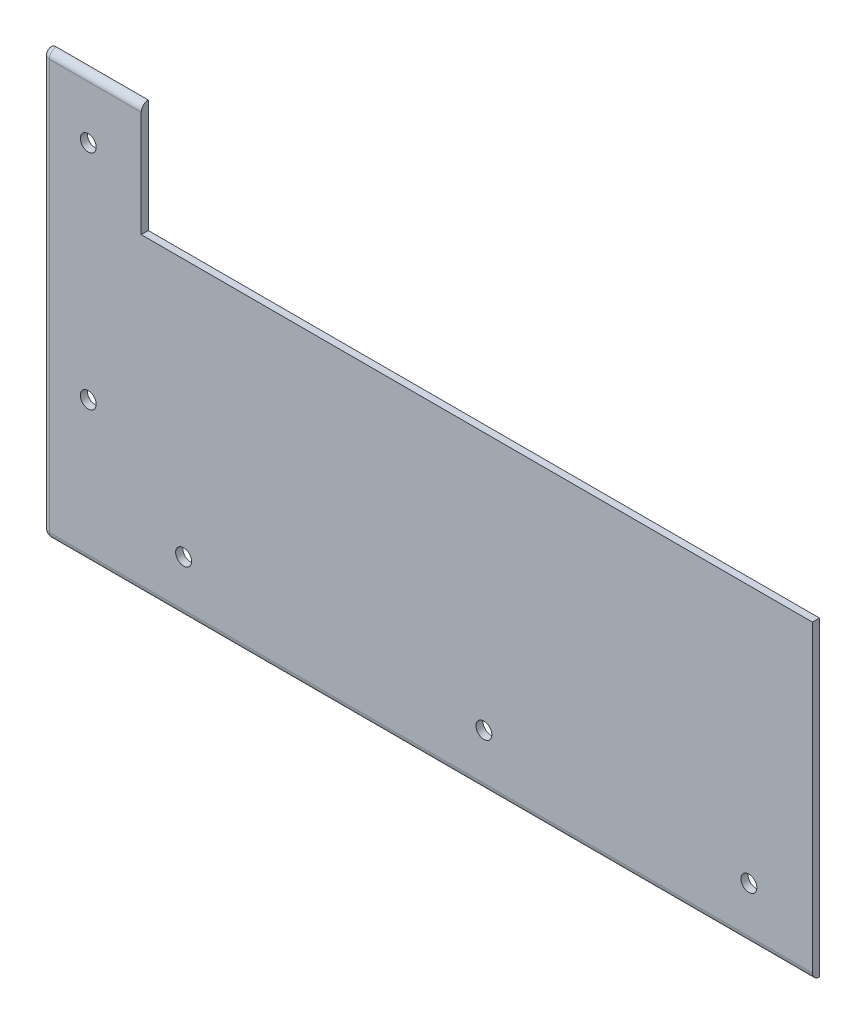
ISO-10303-21;
HEADER;
FILE_DESCRIPTION(('STEP AP214'),'2;1');
FILE_NAME('part.step','',(''),(''),'','','');
FILE_SCHEMA(('AUTOMOTIVE_DESIGN { 1 0 10303 214 1 1 1 1 }'));
ENDSEC;
DATA;
#1=APPLICATION_CONTEXT('core data for automotive mechanical design processes');
#2=APPLICATION_PROTOCOL_DEFINITION('international standard','automotive_design',2000,#1);
#3=PRODUCT_CONTEXT('',#1,'mechanical');
#4=PRODUCT('Part','Part','',(#3));
#5=PRODUCT_RELATED_PRODUCT_CATEGORY('part','',(#4));
#6=PRODUCT_DEFINITION_FORMATION('','',#4);
#7=PRODUCT_DEFINITION_CONTEXT('part definition',#1,'design');
#8=PRODUCT_DEFINITION('design','',#6,#7);
#9=PRODUCT_DEFINITION_SHAPE('','',#8);
#10=(LENGTH_UNIT() NAMED_UNIT(*) SI_UNIT(.MILLI.,.METRE.));
#11=(NAMED_UNIT(*) PLANE_ANGLE_UNIT() SI_UNIT($,.RADIAN.));
#12=(NAMED_UNIT(*) SI_UNIT($,.STERADIAN.) SOLID_ANGLE_UNIT());
#13=UNCERTAINTY_MEASURE_WITH_UNIT(LENGTH_MEASURE(1.E-05),#10,'distance_accuracy_value','');
#14=(GEOMETRIC_REPRESENTATION_CONTEXT(3) GLOBAL_UNCERTAINTY_ASSIGNED_CONTEXT((#13)) GLOBAL_UNIT_ASSIGNED_CONTEXT((#10,
#11,#12)) REPRESENTATION_CONTEXT('',''));
#15=CARTESIAN_POINT('',(0.,0.,0.));
#16=DIRECTION('',(0.,0.,1.));
#17=DIRECTION('',(1.,0.,0.));
#18=AXIS2_PLACEMENT_3D('',#15,#16,#17);
#19=CARTESIAN_POINT('',(109.,60.,0.));
#20=DIRECTION('',(0.,0.,1.));
#21=DIRECTION('',(1.,0.,0.));
#22=AXIS2_PLACEMENT_3D('',#19,#20,#21);
#23=PLANE('',#22);
#24=CARTESIAN_POINT('',(13.,40.,0.));
#25=DIRECTION('',(0.,0.,-1.));
#26=DIRECTION('',(1.,0.,0.));
#27=AXIS2_PLACEMENT_3D('',#24,#25,#26);
#28=CIRCLE('',#27,2.25);
#29=CARTESIAN_POINT('',(10.75,40.,0.));
#30=VERTEX_POINT('',#29);
#31=EDGE_CURVE('E247',#30,#30,#28,.T.);
#32=ORIENTED_EDGE('',*,*,#31,.F.);
#33=EDGE_LOOP('',(#32));
#34=FACE_BOUND('',#33,.T.);
#35=CARTESIAN_POINT('',(40.,15.,0.));
#36=DIRECTION('',(0.,0.,-1.));
#37=DIRECTION('',(1.,0.,0.));
#38=AXIS2_PLACEMENT_3D('',#35,#36,#37);
#39=CIRCLE('',#38,2.25);
#40=CARTESIAN_POINT('',(37.75,15.,0.));
#41=VERTEX_POINT('',#40);
#42=EDGE_CURVE('E195',#41,#41,#39,.T.);
#43=ORIENTED_EDGE('',*,*,#42,.F.);
#44=EDGE_LOOP('',(#43));
#45=FACE_BOUND('',#44,.T.);
#46=CARTESIAN_POINT('',(125.,15.,0.));
#47=DIRECTION('',(0.,0.,-1.));
#48=DIRECTION('',(1.,0.,0.));
#49=AXIS2_PLACEMENT_3D('',#46,#47,#48);
#50=CIRCLE('',#49,2.25);
#51=CARTESIAN_POINT('',(122.75,15.,0.));
#52=VERTEX_POINT('',#51);
#53=EDGE_CURVE('E187',#52,#52,#50,.T.);
#54=ORIENTED_EDGE('',*,*,#53,.F.);
#55=EDGE_LOOP('',(#54));
#56=FACE_BOUND('',#55,.T.);
#57=CARTESIAN_POINT('',(13.,103.,0.));
#58=DIRECTION('',(0.,0.,-1.));
#59=DIRECTION('',(1.,0.,0.));
#60=AXIS2_PLACEMENT_3D('',#57,#58,#59);
#61=CIRCLE('',#60,2.25);
#62=CARTESIAN_POINT('',(10.75,103.,0.));
#63=VERTEX_POINT('',#62);
#64=EDGE_CURVE('E223',#63,#63,#61,.T.);
#65=ORIENTED_EDGE('',*,*,#64,.F.);
#66=EDGE_LOOP('',(#65));
#67=FACE_BOUND('',#66,.T.);
#68=CARTESIAN_POINT('',(200.,15.,0.));
#69=DIRECTION('',(0.,0.,-1.));
#70=DIRECTION('',(1.,0.,0.));
#71=AXIS2_PLACEMENT_3D('',#68,#69,#70);
#72=CIRCLE('',#71,2.25);
#73=CARTESIAN_POINT('',(197.75,15.,0.));
#74=VERTEX_POINT('',#73);
#75=EDGE_CURVE('E26',#74,#74,#72,.T.);
#76=ORIENTED_EDGE('',*,*,#75,.F.);
#77=EDGE_LOOP('',(#76));
#78=FACE_BOUND('',#77,.T.);
#79=CARTESIAN_POINT('',(2.,118.,0.));
#80=DIRECTION('',(0.,0.,1.));
#81=DIRECTION('',(0.,1.,0.));
#82=AXIS2_PLACEMENT_3D('',#79,#80,#81);
#83=CIRCLE('',#82,2.);
#84=CARTESIAN_POINT('',(2.,120.,0.));
#85=VERTEX_POINT('',#84);
#86=CARTESIAN_POINT('',(0.,118.,0.));
#87=VERTEX_POINT('',#86);
#88=EDGE_CURVE('E151',#85,#87,#83,.T.);
#89=ORIENTED_EDGE('',*,*,#88,.F.);
#90=DIRECTION('',(1.,0.,0.));
#91=VECTOR('',#90,1.);
#92=CARTESIAN_POINT('',(2.,120.,0.));
#93=LINE('',#92,#91);
#94=CARTESIAN_POINT('',(28.,120.,0.));
#95=VERTEX_POINT('',#94);
#96=EDGE_CURVE('E170',#85,#95,#93,.T.);
#97=ORIENTED_EDGE('',*,*,#96,.T.);
#98=DIRECTION('',(0.,-1.,0.));
#99=VECTOR('',#98,1.);
#100=CARTESIAN_POINT('',(28.,120.,0.));
#101=LINE('',#100,#99);
#102=CARTESIAN_POINT('',(28.,88.,0.));
#103=VERTEX_POINT('',#102);
#104=EDGE_CURVE('E160',#95,#103,#101,.T.);
#105=ORIENTED_EDGE('',*,*,#104,.T.);
#106=DIRECTION('',(1.,0.,0.));
#107=VECTOR('',#106,1.);
#108=CARTESIAN_POINT('',(28.,88.,0.));
#109=LINE('',#108,#107);
#110=CARTESIAN_POINT('',(218.,88.,0.));
#111=VERTEX_POINT('',#110);
#112=EDGE_CURVE('E10',#103,#111,#109,.T.);
#113=ORIENTED_EDGE('',*,*,#112,.T.);
#114=DIRECTION('',(0.,-1.,0.));
#115=VECTOR('',#114,1.);
#116=CARTESIAN_POINT('',(218.,88.,0.));
#117=LINE('',#116,#115);
#118=CARTESIAN_POINT('',(218.,0.,0.));
#119=VERTEX_POINT('',#118);
#120=EDGE_CURVE('E134',#111,#119,#117,.T.);
#121=ORIENTED_EDGE('',*,*,#120,.T.);
#122=DIRECTION('',(1.,0.,0.));
#123=VECTOR('',#122,1.);
#124=CARTESIAN_POINT('',(2.,0.,0.));
#125=LINE('',#124,#123);
#126=CARTESIAN_POINT('',(2.,0.,0.));
#127=VERTEX_POINT('',#126);
#128=EDGE_CURVE('E227',#127,#119,#125,.T.);
#129=ORIENTED_EDGE('',*,*,#128,.F.);
#130=CARTESIAN_POINT('',(2.,2.,0.));
#131=DIRECTION('',(0.,0.,1.));
#132=DIRECTION('',(-1.,0.,0.));
#133=AXIS2_PLACEMENT_3D('',#130,#131,#132);
#134=CIRCLE('',#133,2.);
#135=CARTESIAN_POINT('',(0.,2.,0.));
#136=VERTEX_POINT('',#135);
#137=EDGE_CURVE('E230',#136,#127,#134,.T.);
#138=ORIENTED_EDGE('',*,*,#137,.F.);
#139=DIRECTION('',(0.,1.,0.));
#140=VECTOR('',#139,1.);
#141=CARTESIAN_POINT('',(0.,2.,0.));
#142=LINE('',#141,#140);
#143=EDGE_CURVE('E206',#136,#87,#142,.T.);
#144=ORIENTED_EDGE('',*,*,#143,.T.);
#145=EDGE_LOOP('',(#89,#97,#105,#113,#121,#129,#138,#144));
#146=FACE_BOUND('',#145,.T.);
#147=ADVANCED_FACE('F15',(#34,#45,#56,#67,#78,#146),#23,.F.);
#148=CARTESIAN_POINT('',(218.,88.,0.));
#149=DIRECTION('',(0.,1.,0.));
#150=DIRECTION('',(1.,0.,0.));
#151=AXIS2_PLACEMENT_3D('',#148,#149,#150);
#152=PLANE('',#151);
#153=ORIENTED_EDGE('',*,*,#112,.F.);
#154=DIRECTION('',(0.,0.,1.));
#155=VECTOR('',#154,1.);
#156=CARTESIAN_POINT('',(28.,88.,0.));
#157=LINE('',#156,#155);
#158=CARTESIAN_POINT('',(28.,88.,2.));
#159=VERTEX_POINT('',#158);
#160=EDGE_CURVE('E166',#103,#159,#157,.T.);
#161=ORIENTED_EDGE('',*,*,#160,.T.);
#162=DIRECTION('',(-1.,0.,0.));
#163=VECTOR('',#162,1.);
#164=CARTESIAN_POINT('',(28.,88.,2.));
#165=LINE('',#164,#163);
#166=CARTESIAN_POINT('',(218.,88.,2.));
#167=VERTEX_POINT('',#166);
#168=EDGE_CURVE('E194',#167,#159,#165,.T.);
#169=ORIENTED_EDGE('',*,*,#168,.F.);
#170=DIRECTION('',(0.,0.,1.));
#171=VECTOR('',#170,1.);
#172=CARTESIAN_POINT('',(218.,88.,0.));
#173=LINE('',#172,#171);
#174=EDGE_CURVE('E248',#111,#167,#173,.T.);
#175=ORIENTED_EDGE('',*,*,#174,.F.);
#176=EDGE_LOOP('',(#153,#161,#169,#175));
#177=FACE_BOUND('',#176,.T.);
#178=ADVANCED_FACE('F366',(#177),#152,.T.);
#179=CARTESIAN_POINT('',(200.,15.,0.));
#180=DIRECTION('',(0.,0.,1.));
#181=DIRECTION('',(1.,0.,0.));
#182=AXIS2_PLACEMENT_3D('',#179,#180,#181);
#183=CYLINDRICAL_SURFACE('',#182,2.25);
#184=CARTESIAN_POINT('',(200.,15.,2.));
#185=DIRECTION('',(0.,0.,-1.));
#186=DIRECTION('',(1.,0.,0.));
#187=AXIS2_PLACEMENT_3D('',#184,#185,#186);
#188=CIRCLE('',#187,2.25);
#189=CARTESIAN_POINT('',(197.75,15.,2.));
#190=VERTEX_POINT('',#189);
#191=EDGE_CURVE('E266',#190,#190,#188,.T.);
#192=ORIENTED_EDGE('',*,*,#191,.F.);
#193=DIRECTION('',(0.,0.,-1.));
#194=VECTOR('',#193,1.);
#195=CARTESIAN_POINT('',(197.75,15.,0.));
#196=LINE('',#195,#194);
#197=EDGE_CURVE('E19',#190,#74,#196,.T.);
#198=ORIENTED_EDGE('',*,*,#197,.T.);
#199=ORIENTED_EDGE('',*,*,#75,.T.);
#200=ORIENTED_EDGE('',*,*,#197,.F.);
#201=EDGE_LOOP('',(#192,#198,#199,#200));
#202=FACE_BOUND('',#201,.T.);
#203=ADVANCED_FACE('F17',(#202),#183,.F.);
#204=CARTESIAN_POINT('',(13.,103.,0.));
#205=DIRECTION('',(0.,0.,1.));
#206=DIRECTION('',(1.,0.,0.));
#207=AXIS2_PLACEMENT_3D('',#204,#205,#206);
#208=CYLINDRICAL_SURFACE('',#207,2.25);
#209=CARTESIAN_POINT('',(13.,103.,2.));
#210=DIRECTION('',(0.,0.,-1.));
#211=DIRECTION('',(1.,0.,0.));
#212=AXIS2_PLACEMENT_3D('',#209,#210,#211);
#213=CIRCLE('',#212,2.25);
#214=CARTESIAN_POINT('',(10.75,103.,2.));
#215=VERTEX_POINT('',#214);
#216=EDGE_CURVE('E201',#215,#215,#213,.T.);
#217=ORIENTED_EDGE('',*,*,#216,.F.);
#218=DIRECTION('',(0.,0.,-1.));
#219=VECTOR('',#218,1.);
#220=CARTESIAN_POINT('',(10.75,103.,0.));
#221=LINE('',#220,#219);
#222=EDGE_CURVE('E219',#215,#63,#221,.T.);
#223=ORIENTED_EDGE('',*,*,#222,.T.);
#224=ORIENTED_EDGE('',*,*,#64,.T.);
#225=ORIENTED_EDGE('',*,*,#222,.F.);
#226=EDGE_LOOP('',(#217,#223,#224,#225));
#227=FACE_BOUND('',#226,.T.);
#228=ADVANCED_FACE('F388',(#227),#208,.F.);
#229=CARTESIAN_POINT('',(125.,15.,0.));
#230=DIRECTION('',(0.,0.,1.));
#231=DIRECTION('',(1.,0.,0.));
#232=AXIS2_PLACEMENT_3D('',#229,#230,#231);
#233=CYLINDRICAL_SURFACE('',#232,2.25);
#234=CARTESIAN_POINT('',(125.,15.,2.));
#235=DIRECTION('',(0.,0.,-1.));
#236=DIRECTION('',(1.,0.,0.));
#237=AXIS2_PLACEMENT_3D('',#234,#235,#236);
#238=CIRCLE('',#237,2.25);
#239=CARTESIAN_POINT('',(122.75,15.,2.));
#240=VERTEX_POINT('',#239);
#241=EDGE_CURVE('E198',#240,#240,#238,.T.);
#242=ORIENTED_EDGE('',*,*,#241,.F.);
#243=DIRECTION('',(0.,0.,-1.));
#244=VECTOR('',#243,1.);
#245=CARTESIAN_POINT('',(122.75,15.,0.));
#246=LINE('',#245,#244);
#247=EDGE_CURVE('E106',#240,#52,#246,.T.);
#248=ORIENTED_EDGE('',*,*,#247,.T.);
#249=ORIENTED_EDGE('',*,*,#53,.T.);
#250=ORIENTED_EDGE('',*,*,#247,.F.);
#251=EDGE_LOOP('',(#242,#248,#249,#250));
#252=FACE_BOUND('',#251,.T.);
#253=ADVANCED_FACE('F393',(#252),#233,.F.);
#254=CARTESIAN_POINT('',(40.,15.,0.));
#255=DIRECTION('',(0.,0.,1.));
#256=DIRECTION('',(1.,0.,0.));
#257=AXIS2_PLACEMENT_3D('',#254,#255,#256);
#258=CYLINDRICAL_SURFACE('',#257,2.25);
#259=CARTESIAN_POINT('',(40.,15.,2.));
#260=DIRECTION('',(0.,0.,-1.));
#261=DIRECTION('',(1.,0.,0.));
#262=AXIS2_PLACEMENT_3D('',#259,#260,#261);
#263=CIRCLE('',#262,2.25);
#264=CARTESIAN_POINT('',(37.75,15.,2.));
#265=VERTEX_POINT('',#264);
#266=EDGE_CURVE('E193',#265,#265,#263,.T.);
#267=ORIENTED_EDGE('',*,*,#266,.F.);
#268=DIRECTION('',(0.,0.,-1.));
#269=VECTOR('',#268,1.);
#270=CARTESIAN_POINT('',(37.75,15.,0.));
#271=LINE('',#270,#269);
#272=EDGE_CURVE('E120',#265,#41,#271,.T.);
#273=ORIENTED_EDGE('',*,*,#272,.T.);
#274=ORIENTED_EDGE('',*,*,#42,.T.);
#275=ORIENTED_EDGE('',*,*,#272,.F.);
#276=EDGE_LOOP('',(#267,#273,#274,#275));
#277=FACE_BOUND('',#276,.T.);
#278=ADVANCED_FACE('F426',(#277),#258,.F.);
#279=CARTESIAN_POINT('',(13.,40.,0.));
#280=DIRECTION('',(0.,0.,1.));
#281=DIRECTION('',(1.,0.,0.));
#282=AXIS2_PLACEMENT_3D('',#279,#280,#281);
#283=CYLINDRICAL_SURFACE('',#282,2.25);
#284=CARTESIAN_POINT('',(13.,40.,2.));
#285=DIRECTION('',(0.,0.,-1.));
#286=DIRECTION('',(1.,0.,0.));
#287=AXIS2_PLACEMENT_3D('',#284,#285,#286);
#288=CIRCLE('',#287,2.25);
#289=CARTESIAN_POINT('',(10.75,40.,2.));
#290=VERTEX_POINT('',#289);
#291=EDGE_CURVE('E189',#290,#290,#288,.T.);
#292=ORIENTED_EDGE('',*,*,#291,.F.);
#293=DIRECTION('',(0.,0.,-1.));
#294=VECTOR('',#293,1.);
#295=CARTESIAN_POINT('',(10.75,40.,0.));
#296=LINE('',#295,#294);
#297=EDGE_CURVE('E243',#290,#30,#296,.T.);
#298=ORIENTED_EDGE('',*,*,#297,.T.);
#299=ORIENTED_EDGE('',*,*,#31,.T.);
#300=ORIENTED_EDGE('',*,*,#297,.F.);
#301=EDGE_LOOP('',(#292,#298,#299,#300));
#302=FACE_BOUND('',#301,.T.);
#303=ADVANCED_FACE('F420',(#302),#283,.F.);
#304=CARTESIAN_POINT('',(218.,0.,0.));
#305=DIRECTION('',(1.,0.,0.));
#306=DIRECTION('',(0.,1.,0.));
#307=AXIS2_PLACEMENT_3D('',#304,#305,#306);
#308=PLANE('',#307);
#309=CARTESIAN_POINT('',(218.,2.,0.));
#310=DIRECTION('',(-1.,0.,0.));
#311=DIRECTION('',(0.,-0.707106781186548,0.707106781186547));
#312=AXIS2_PLACEMENT_3D('',#309,#310,#311);
#313=CIRCLE('',#312,2.);
#314=CARTESIAN_POINT('',(218.,2.00000000000003,2.));
#315=VERTEX_POINT('',#314);
#316=EDGE_CURVE('E218',#119,#315,#313,.T.);
#317=ORIENTED_EDGE('',*,*,#316,.F.);
#318=ORIENTED_EDGE('',*,*,#120,.F.);
#319=ORIENTED_EDGE('',*,*,#174,.T.);
#320=DIRECTION('',(0.,1.,0.));
#321=VECTOR('',#320,1.);
#322=CARTESIAN_POINT('',(218.,88.,2.));
#323=LINE('',#322,#321);
#324=EDGE_CURVE('E143',#315,#167,#323,.T.);
#325=ORIENTED_EDGE('',*,*,#324,.F.);
#326=EDGE_LOOP('',(#317,#318,#319,#325));
#327=FACE_BOUND('',#326,.T.);
#328=ADVANCED_FACE('F425',(#327),#308,.T.);
#329=CARTESIAN_POINT('',(109.,60.,2.));
#330=DIRECTION('',(0.,0.,1.));
#331=DIRECTION('',(1.,0.,0.));
#332=AXIS2_PLACEMENT_3D('',#329,#330,#331);
#333=PLANE('',#332);
#334=ORIENTED_EDGE('',*,*,#191,.T.);
#335=EDGE_LOOP('',(#334));
#336=FACE_BOUND('',#335,.T.);
#337=ORIENTED_EDGE('',*,*,#216,.T.);
#338=EDGE_LOOP('',(#337));
#339=FACE_BOUND('',#338,.T.);
#340=ORIENTED_EDGE('',*,*,#241,.T.);
#341=EDGE_LOOP('',(#340));
#342=FACE_BOUND('',#341,.T.);
#343=ORIENTED_EDGE('',*,*,#266,.T.);
#344=EDGE_LOOP('',(#343));
#345=FACE_BOUND('',#344,.T.);
#346=ORIENTED_EDGE('',*,*,#291,.T.);
#347=EDGE_LOOP('',(#346));
#348=FACE_BOUND('',#347,.T.);
#349=DIRECTION('',(1.,0.,0.));
#350=VECTOR('',#349,1.);
#351=CARTESIAN_POINT('',(68.5,118.,2.));
#352=LINE('',#351,#350);
#353=CARTESIAN_POINT('',(2.,118.,2.));
#354=VERTEX_POINT('',#353);
#355=CARTESIAN_POINT('',(28.,118.,2.));
#356=VERTEX_POINT('',#355);
#357=EDGE_CURVE('E179',#354,#356,#352,.T.);
#358=ORIENTED_EDGE('',*,*,#357,.F.);
#359=DIRECTION('',(0.,1.,0.));
#360=VECTOR('',#359,1.);
#361=CARTESIAN_POINT('',(2.,89.,2.));
#362=LINE('',#361,#360);
#363=CARTESIAN_POINT('',(2.,2.,2.));
#364=VERTEX_POINT('',#363);
#365=EDGE_CURVE('E239',#364,#354,#362,.T.);
#366=ORIENTED_EDGE('',*,*,#365,.F.);
#367=DIRECTION('',(-1.,0.,0.));
#368=VECTOR('',#367,1.);
#369=CARTESIAN_POINT('',(55.5,2.,2.));
#370=LINE('',#369,#368);
#371=EDGE_CURVE('E213',#315,#364,#370,.T.);
#372=ORIENTED_EDGE('',*,*,#371,.F.);
#373=ORIENTED_EDGE('',*,*,#324,.T.);
#374=ORIENTED_EDGE('',*,*,#168,.T.);
#375=DIRECTION('',(0.,1.,0.));
#376=VECTOR('',#375,1.);
#377=CARTESIAN_POINT('',(28.,120.,2.));
#378=LINE('',#377,#376);
#379=EDGE_CURVE('E231',#159,#356,#378,.T.);
#380=ORIENTED_EDGE('',*,*,#379,.T.);
#381=EDGE_LOOP('',(#358,#366,#372,#373,#374,#380));
#382=FACE_BOUND('',#381,.T.);
#383=ADVANCED_FACE('F437',(#336,#339,#342,#345,#348,#382),#333,.T.);
#384=CARTESIAN_POINT('',(28.,88.,0.));
#385=DIRECTION('',(1.,0.,0.));
#386=DIRECTION('',(0.,1.,0.));
#387=AXIS2_PLACEMENT_3D('',#384,#385,#386);
#388=PLANE('',#387);
#389=CARTESIAN_POINT('',(28.,118.,0.));
#390=DIRECTION('',(-1.,0.,0.));
#391=DIRECTION('',(0.,0.707106781186546,0.707106781186549));
#392=AXIS2_PLACEMENT_3D('',#389,#390,#391);
#393=CIRCLE('',#392,2.);
#394=EDGE_CURVE('E164',#356,#95,#393,.T.);
#395=ORIENTED_EDGE('',*,*,#394,.F.);
#396=ORIENTED_EDGE('',*,*,#379,.F.);
#397=ORIENTED_EDGE('',*,*,#160,.F.);
#398=ORIENTED_EDGE('',*,*,#104,.F.);
#399=EDGE_LOOP('',(#395,#396,#397,#398));
#400=FACE_BOUND('',#399,.T.);
#401=ADVANCED_FACE('F161',(#400),#388,.T.);
#402=CARTESIAN_POINT('',(2.,2.,0.));
#403=DIRECTION('',(-0.816496580927727,0.408248290463863,-0.408248290463861));
#404=DIRECTION('',(-0.577350269189624,-0.577350269189627,0.577350269189626));
#405=AXIS2_PLACEMENT_3D('',#402,#403,#404);
#406=SPHERICAL_SURFACE('',#405,2.);
#407=CARTESIAN_POINT('',(2.,2.,0.));
#408=DIRECTION('',(1.,0.,0.));
#409=DIRECTION('',(0.,0.,1.));
#410=AXIS2_PLACEMENT_3D('',#407,#408,#409);
#411=CIRCLE('',#410,2.);
#412=EDGE_CURVE('E217',#364,#127,#411,.T.);
#413=ORIENTED_EDGE('',*,*,#412,.F.);
#414=CARTESIAN_POINT('',(2.,2.,0.));
#415=DIRECTION('',(0.,1.,0.));
#416=DIRECTION('',(-1.,0.,0.));
#417=AXIS2_PLACEMENT_3D('',#414,#415,#416);
#418=CIRCLE('',#417,2.);
#419=EDGE_CURVE('E208',#136,#364,#418,.T.);
#420=ORIENTED_EDGE('',*,*,#419,.F.);
#421=ORIENTED_EDGE('',*,*,#137,.T.);
#422=EDGE_LOOP('',(#413,#420,#421));
#423=FACE_BOUND('',#422,.T.);
#424=ADVANCED_FACE('F374',(#423),#406,.T.);
#425=CARTESIAN_POINT('',(55.5,2.,0.));
#426=DIRECTION('',(1.,0.,0.));
#427=DIRECTION('',(0.,-0.707106781186548,0.707106781186547));
#428=AXIS2_PLACEMENT_3D('',#425,#426,#427);
#429=CYLINDRICAL_SURFACE('',#428,2.);
#430=ORIENTED_EDGE('',*,*,#316,.T.);
#431=ORIENTED_EDGE('',*,*,#371,.T.);
#432=ORIENTED_EDGE('',*,*,#412,.T.);
#433=ORIENTED_EDGE('',*,*,#128,.T.);
#434=EDGE_LOOP('',(#430,#431,#432,#433));
#435=FACE_BOUND('',#434,.T.);
#436=ADVANCED_FACE('F379',(#435),#429,.T.);
#437=CARTESIAN_POINT('',(2.,118.,0.));
#438=DIRECTION('',(-0.81649658092773,-0.40824829046386,-0.408248290463858));
#439=DIRECTION('',(-0.57735026918962,0.57735026918963,0.577350269189627));
#440=AXIS2_PLACEMENT_3D('',#437,#438,#439);
#441=SPHERICAL_SURFACE('',#440,2.);
#442=CARTESIAN_POINT('',(2.,118.,0.));
#443=DIRECTION('',(0.,-1.,0.));
#444=DIRECTION('',(0.,0.,1.));
#445=AXIS2_PLACEMENT_3D('',#442,#443,#444);
#446=CIRCLE('',#445,2.);
#447=EDGE_CURVE('E209',#354,#87,#446,.T.);
#448=ORIENTED_EDGE('',*,*,#447,.F.);
#449=CARTESIAN_POINT('',(2.,118.,0.));
#450=DIRECTION('',(1.,0.,0.));
#451=DIRECTION('',(0.,1.,0.));
#452=AXIS2_PLACEMENT_3D('',#449,#450,#451);
#453=CIRCLE('',#452,2.);
#454=EDGE_CURVE('E174',#85,#354,#453,.T.);
#455=ORIENTED_EDGE('',*,*,#454,.F.);
#456=ORIENTED_EDGE('',*,*,#88,.T.);
#457=EDGE_LOOP('',(#448,#455,#456));
#458=FACE_BOUND('',#457,.T.);
#459=ADVANCED_FACE('F352',(#458),#441,.T.);
#460=CARTESIAN_POINT('',(2.,89.,0.));
#461=DIRECTION('',(0.,-1.,0.));
#462=DIRECTION('',(-0.707106781186548,0.,0.707106781186547));
#463=AXIS2_PLACEMENT_3D('',#460,#461,#462);
#464=CYLINDRICAL_SURFACE('',#463,2.);
#465=ORIENTED_EDGE('',*,*,#447,.T.);
#466=ORIENTED_EDGE('',*,*,#143,.F.);
#467=ORIENTED_EDGE('',*,*,#419,.T.);
#468=ORIENTED_EDGE('',*,*,#365,.T.);
#469=EDGE_LOOP('',(#465,#466,#467,#468));
#470=FACE_BOUND('',#469,.T.);
#471=ADVANCED_FACE('F346',(#470),#464,.T.);
#472=CARTESIAN_POINT('',(68.5,118.,0.));
#473=DIRECTION('',(-1.,0.,0.));
#474=DIRECTION('',(0.,0.707106781186546,0.707106781186549));
#475=AXIS2_PLACEMENT_3D('',#472,#473,#474);
#476=CYLINDRICAL_SURFACE('',#475,2.);
#477=ORIENTED_EDGE('',*,*,#394,.T.);
#478=ORIENTED_EDGE('',*,*,#96,.F.);
#479=ORIENTED_EDGE('',*,*,#454,.T.);
#480=ORIENTED_EDGE('',*,*,#357,.T.);
#481=EDGE_LOOP('',(#477,#478,#479,#480));
#482=FACE_BOUND('',#481,.T.);
#483=ADVANCED_FACE('F177',(#482),#476,.T.);
#484=CLOSED_SHELL('',(#147,#178,#203,#228,#253,#278,#303,#328,#383,#401,#424,#436,#459,#471,#483));
#485=MANIFOLD_SOLID_BREP('B1',#484);
#486=ADVANCED_BREP_SHAPE_REPRESENTATION('',(#18,#485),#14);
#487=SHAPE_DEFINITION_REPRESENTATION(#9,#486);
ENDSEC;
END-ISO-10303-21;
